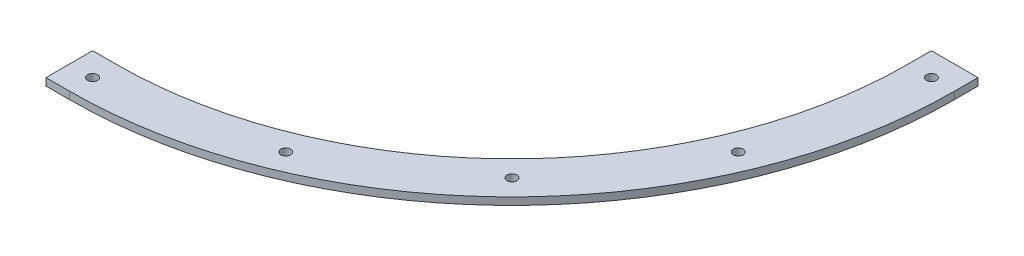
ISO-10303-21;
HEADER;
FILE_DESCRIPTION(('STEP AP214'),'2;1');
FILE_NAME('part.step','',(''),(''),'','','');
FILE_SCHEMA(('AUTOMOTIVE_DESIGN { 1 0 10303 214 1 1 1 1 }'));
ENDSEC;
DATA;
#1=APPLICATION_CONTEXT('core data for automotive mechanical design processes');
#2=APPLICATION_PROTOCOL_DEFINITION('international standard','automotive_design',2000,#1);
#3=PRODUCT_CONTEXT('',#1,'mechanical');
#4=PRODUCT('Part','Part','',(#3));
#5=PRODUCT_RELATED_PRODUCT_CATEGORY('part','',(#4));
#6=PRODUCT_DEFINITION_FORMATION('','',#4);
#7=PRODUCT_DEFINITION_CONTEXT('part definition',#1,'design');
#8=PRODUCT_DEFINITION('design','',#6,#7);
#9=PRODUCT_DEFINITION_SHAPE('','',#8);
#10=(LENGTH_UNIT() NAMED_UNIT(*) SI_UNIT(.MILLI.,.METRE.));
#11=(NAMED_UNIT(*) PLANE_ANGLE_UNIT() SI_UNIT($,.RADIAN.));
#12=(NAMED_UNIT(*) SI_UNIT($,.STERADIAN.) SOLID_ANGLE_UNIT());
#13=UNCERTAINTY_MEASURE_WITH_UNIT(LENGTH_MEASURE(1.E-05),#10,'distance_accuracy_value','');
#14=(GEOMETRIC_REPRESENTATION_CONTEXT(3) GLOBAL_UNCERTAINTY_ASSIGNED_CONTEXT((#13)) GLOBAL_UNIT_ASSIGNED_CONTEXT((#10,
#11,#12)) REPRESENTATION_CONTEXT('',''));
#15=CARTESIAN_POINT('',(0.,0.,0.));
#16=DIRECTION('',(0.,0.,1.));
#17=DIRECTION('',(1.,0.,0.));
#18=AXIS2_PLACEMENT_3D('',#15,#16,#17);
#19=CARTESIAN_POINT('',(280.,3.175,-3.10862446895044E-13));
#20=DIRECTION('',(1.,0.,0.));
#21=DIRECTION('',(0.,0.,-1.));
#22=AXIS2_PLACEMENT_3D('',#19,#20,#21);
#23=PLANE('',#22);
#24=DIRECTION('',(0.,0.,1.));
#25=VECTOR('',#24,1.);
#26=CARTESIAN_POINT('',(280.,3.175,-3.10862446895044E-13));
#27=LINE('',#26,#25);
#28=CARTESIAN_POINT('',(279.999999999996,3.175,80.0000000000061));
#29=VERTEX_POINT('',#28);
#30=CARTESIAN_POINT('',(279.999999999999,3.175,90.000000000002));
#31=VERTEX_POINT('',#30);
#32=EDGE_CURVE('E120',#29,#31,#27,.T.);
#33=ORIENTED_EDGE('',*,*,#32,.T.);
#34=DIRECTION('',(0.,1.,0.));
#35=VECTOR('',#34,1.);
#36=CARTESIAN_POINT('',(279.999999999999,0.,90.000000000002));
#37=LINE('',#36,#35);
#38=CARTESIAN_POINT('',(279.999999999999,0.,90.000000000002));
#39=VERTEX_POINT('',#38);
#40=EDGE_CURVE('E130',#39,#31,#37,.T.);
#41=ORIENTED_EDGE('',*,*,#40,.F.);
#42=DIRECTION('',(0.,0.,1.));
#43=VECTOR('',#42,1.);
#44=CARTESIAN_POINT('',(280.,0.,-3.10862446895044E-13));
#45=LINE('',#44,#43);
#46=CARTESIAN_POINT('',(279.999999999996,0.,80.0000000000061));
#47=VERTEX_POINT('',#46);
#48=EDGE_CURVE('E145',#47,#39,#45,.T.);
#49=ORIENTED_EDGE('',*,*,#48,.F.);
#50=DIRECTION('',(0.,1.,0.));
#51=VECTOR('',#50,1.);
#52=CARTESIAN_POINT('',(279.999999999996,0.,80.0000000000061));
#53=LINE('',#52,#51);
#54=EDGE_CURVE('E140',#47,#29,#53,.T.);
#55=ORIENTED_EDGE('',*,*,#54,.T.);
#56=EDGE_LOOP('',(#33,#41,#49,#55));
#57=FACE_BOUND('',#56,.T.);
#58=ADVANCED_FACE('F45',(#57),#23,.T.);
#59=CARTESIAN_POINT('',(89.9999999999998,3.175,270.));
#60=DIRECTION('',(0.,-1.,0.));
#61=DIRECTION('',(0.,0.,-1.));
#62=AXIS2_PLACEMENT_3D('',#59,#60,#61);
#63=CYLINDRICAL_SURFACE('',#62,2.12499999999998);
#64=CARTESIAN_POINT('',(89.9999999999998,3.175,270.));
#65=DIRECTION('',(0.,1.,0.));
#66=DIRECTION('',(0.,0.,1.));
#67=AXIS2_PLACEMENT_3D('',#64,#65,#66);
#68=CIRCLE('',#67,2.12499999999998);
#69=CARTESIAN_POINT('',(89.9999999999998,3.175,272.125));
#70=VERTEX_POINT('',#69);
#71=EDGE_CURVE('E55',#70,#70,#68,.T.);
#72=ORIENTED_EDGE('',*,*,#71,.T.);
#73=EDGE_LOOP('',(#72));
#74=FACE_BOUND('',#73,.T.);
#75=CARTESIAN_POINT('',(89.9999999999998,0.,270.));
#76=DIRECTION('',(0.,1.,0.));
#77=DIRECTION('',(0.,0.,1.));
#78=AXIS2_PLACEMENT_3D('',#75,#76,#77);
#79=CIRCLE('',#78,2.12499999999998);
#80=CARTESIAN_POINT('',(89.9999999999998,0.,272.125));
#81=VERTEX_POINT('',#80);
#82=EDGE_CURVE('E185',#81,#81,#79,.T.);
#83=ORIENTED_EDGE('',*,*,#82,.F.);
#84=EDGE_LOOP('',(#83));
#85=FACE_BOUND('',#84,.T.);
#86=ADVANCED_FACE('F47',(#74,#85),#63,.F.);
#87=CARTESIAN_POINT('',(0.,3.175,0.));
#88=DIRECTION('',(0.,1.,0.));
#89=DIRECTION('',(0.,0.,1.));
#90=AXIS2_PLACEMENT_3D('',#87,#88,#89);
#91=PLANE('',#90);
#92=CARTESIAN_POINT('',(256.207454383142,3.175,159.101968911715));
#93=DIRECTION('',(0.,1.,0.));
#94=DIRECTION('',(0.,0.,1.));
#95=AXIS2_PLACEMENT_3D('',#92,#93,#94);
#96=CIRCLE('',#95,2.12499999999993);
#97=CARTESIAN_POINT('',(256.207454383142,3.175,161.226968911715));
#98=VERTEX_POINT('',#97);
#99=EDGE_CURVE('E263',#98,#98,#96,.T.);
#100=ORIENTED_EDGE('',*,*,#99,.F.);
#101=EDGE_LOOP('',(#100));
#102=FACE_BOUND('',#101,.T.);
#103=CARTESIAN_POINT('',(159.101968911713,3.175,256.207454383144));
#104=DIRECTION('',(0.,1.,0.));
#105=DIRECTION('',(0.,0.,-1.));
#106=AXIS2_PLACEMENT_3D('',#103,#104,#105);
#107=CIRCLE('',#106,2.125);
#108=CARTESIAN_POINT('',(159.101968911713,3.175,254.082454383144));
#109=VERTEX_POINT('',#108);
#110=EDGE_CURVE('E267',#109,#109,#107,.T.);
#111=ORIENTED_EDGE('',*,*,#110,.F.);
#112=EDGE_LOOP('',(#111));
#113=FACE_BOUND('',#112,.T.);
#114=CARTESIAN_POINT('',(90.0000000000011,3.175,90.000000000002));
#115=DIRECTION('',(0.,1.,0.));
#116=DIRECTION('',(0.,0.,1.));
#117=AXIS2_PLACEMENT_3D('',#114,#115,#116);
#118=CIRCLE('',#117,189.999999999998);
#119=CARTESIAN_POINT('',(89.9999999999997,3.175,280.));
#120=VERTEX_POINT('',#119);
#121=EDGE_CURVE('E114',#120,#31,#118,.T.);
#122=ORIENTED_EDGE('',*,*,#121,.T.);
#123=ORIENTED_EDGE('',*,*,#32,.F.);
#124=DIRECTION('',(1.,0.,0.));
#125=VECTOR('',#124,1.);
#126=CARTESIAN_POINT('',(260.000000000002,3.175,80.0000000000061));
#127=LINE('',#126,#125);
#128=CARTESIAN_POINT('',(260.000000000002,3.175,80.0000000000061));
#129=VERTEX_POINT('',#128);
#130=EDGE_CURVE('E141',#129,#29,#127,.T.);
#131=ORIENTED_EDGE('',*,*,#130,.F.);
#132=DIRECTION('',(0.,0.,-1.));
#133=VECTOR('',#132,1.);
#134=CARTESIAN_POINT('',(260.000000000002,3.175,80.0000000000061));
#135=LINE('',#134,#133);
#136=CARTESIAN_POINT('',(260.000000000002,3.175,90.000000000003));
#137=VERTEX_POINT('',#136);
#138=EDGE_CURVE('E127',#137,#129,#135,.T.);
#139=ORIENTED_EDGE('',*,*,#138,.F.);
#140=CARTESIAN_POINT('',(90.0000000000011,3.175,90.000000000002));
#141=DIRECTION('',(0.,-1.,0.));
#142=DIRECTION('',(0.,0.,1.));
#143=AXIS2_PLACEMENT_3D('',#140,#141,#142);
#144=CIRCLE('',#143,169.999999999998);
#145=CARTESIAN_POINT('',(89.9999999999998,3.175,260.));
#146=VERTEX_POINT('',#145);
#147=EDGE_CURVE('E168',#137,#146,#144,.T.);
#148=ORIENTED_EDGE('',*,*,#147,.T.);
#149=DIRECTION('',(1.,0.,0.));
#150=VECTOR('',#149,1.);
#151=CARTESIAN_POINT('',(79.9999999999997,3.175,260.));
#152=LINE('',#151,#150);
#153=CARTESIAN_POINT('',(79.9999999999997,3.175,260.));
#154=VERTEX_POINT('',#153);
#155=EDGE_CURVE('E178',#154,#146,#152,.T.);
#156=ORIENTED_EDGE('',*,*,#155,.F.);
#157=DIRECTION('',(0.,0.,-1.));
#158=VECTOR('',#157,1.);
#159=CARTESIAN_POINT('',(79.9999999999997,3.175,260.));
#160=LINE('',#159,#158);
#161=CARTESIAN_POINT('',(79.9999999999997,3.175,280.));
#162=VERTEX_POINT('',#161);
#163=EDGE_CURVE('E164',#162,#154,#160,.T.);
#164=ORIENTED_EDGE('',*,*,#163,.F.);
#165=DIRECTION('',(-1.,0.,0.));
#166=VECTOR('',#165,1.);
#167=CARTESIAN_POINT('',(-4.6629367034257E-13,3.175,280.));
#168=LINE('',#167,#166);
#169=EDGE_CURVE('E11',#120,#162,#168,.T.);
#170=ORIENTED_EDGE('',*,*,#169,.F.);
#171=EDGE_LOOP('',(#122,#123,#131,#139,#148,#156,#164,#170));
#172=FACE_BOUND('',#171,.T.);
#173=CARTESIAN_POINT('',(217.279220613578,3.175,217.27922061358));
#174=DIRECTION('',(0.,1.,0.));
#175=DIRECTION('',(0.,0.,1.));
#176=AXIS2_PLACEMENT_3D('',#173,#174,#175);
#177=CIRCLE('',#176,2.12499999999994);
#178=CARTESIAN_POINT('',(217.279220613578,3.175,219.40422061358));
#179=VERTEX_POINT('',#178);
#180=EDGE_CURVE('E264',#179,#179,#177,.T.);
#181=ORIENTED_EDGE('',*,*,#180,.F.);
#182=EDGE_LOOP('',(#181));
#183=FACE_BOUND('',#182,.T.);
#184=ORIENTED_EDGE('',*,*,#71,.F.);
#185=EDGE_LOOP('',(#184));
#186=FACE_BOUND('',#185,.T.);
#187=CARTESIAN_POINT('',(269.999999999999,3.175,90.000000000003));
#188=DIRECTION('',(0.,-1.,0.));
#189=DIRECTION('',(0.,0.,1.));
#190=AXIS2_PLACEMENT_3D('',#187,#188,#189);
#191=CIRCLE('',#190,2.12499999999999);
#192=CARTESIAN_POINT('',(269.999999999999,3.175,92.125000000003));
#193=VERTEX_POINT('',#192);
#194=EDGE_CURVE('E126',#193,#193,#191,.T.);
#195=ORIENTED_EDGE('',*,*,#194,.T.);
#196=EDGE_LOOP('',(#195));
#197=FACE_BOUND('',#196,.T.);
#198=ADVANCED_FACE('F116',(#102,#113,#172,#183,#186,#197),#91,.T.);
#199=CARTESIAN_POINT('',(0.,0.,0.));
#200=DIRECTION('',(0.,1.,0.));
#201=DIRECTION('',(0.,0.,1.));
#202=AXIS2_PLACEMENT_3D('',#199,#200,#201);
#203=PLANE('',#202);
#204=CARTESIAN_POINT('',(256.207454383142,0.,159.101968911715));
#205=DIRECTION('',(0.,1.,0.));
#206=DIRECTION('',(0.,0.,1.));
#207=AXIS2_PLACEMENT_3D('',#204,#205,#206);
#208=CIRCLE('',#207,2.12499999999993);
#209=CARTESIAN_POINT('',(256.207454383142,0.,161.226968911715));
#210=VERTEX_POINT('',#209);
#211=EDGE_CURVE('E260',#210,#210,#208,.T.);
#212=ORIENTED_EDGE('',*,*,#211,.T.);
#213=EDGE_LOOP('',(#212));
#214=FACE_BOUND('',#213,.T.);
#215=CARTESIAN_POINT('',(159.101968911713,0.,256.207454383144));
#216=DIRECTION('',(0.,1.,0.));
#217=DIRECTION('',(0.,0.,-1.));
#218=AXIS2_PLACEMENT_3D('',#215,#216,#217);
#219=CIRCLE('',#218,2.125);
#220=CARTESIAN_POINT('',(159.101968911713,0.,254.082454383144));
#221=VERTEX_POINT('',#220);
#222=EDGE_CURVE('E136',#221,#221,#219,.T.);
#223=ORIENTED_EDGE('',*,*,#222,.T.);
#224=EDGE_LOOP('',(#223));
#225=FACE_BOUND('',#224,.T.);
#226=CARTESIAN_POINT('',(217.279220613578,0.,217.27922061358));
#227=DIRECTION('',(0.,1.,0.));
#228=DIRECTION('',(0.,0.,1.));
#229=AXIS2_PLACEMENT_3D('',#226,#227,#228);
#230=CIRCLE('',#229,2.12499999999994);
#231=CARTESIAN_POINT('',(217.279220613578,0.,219.40422061358));
#232=VERTEX_POINT('',#231);
#233=EDGE_CURVE('E158',#232,#232,#230,.T.);
#234=ORIENTED_EDGE('',*,*,#233,.T.);
#235=EDGE_LOOP('',(#234));
#236=FACE_BOUND('',#235,.T.);
#237=ORIENTED_EDGE('',*,*,#48,.T.);
#238=CARTESIAN_POINT('',(90.0000000000011,0.,90.000000000002));
#239=DIRECTION('',(0.,1.,0.));
#240=DIRECTION('',(0.,0.,1.));
#241=AXIS2_PLACEMENT_3D('',#238,#239,#240);
#242=CIRCLE('',#241,189.999999999998);
#243=CARTESIAN_POINT('',(89.9999999999997,0.,280.));
#244=VERTEX_POINT('',#243);
#245=EDGE_CURVE('E132',#39,#244,#242,.F.);
#246=ORIENTED_EDGE('',*,*,#245,.T.);
#247=DIRECTION('',(-1.,0.,0.));
#248=VECTOR('',#247,1.);
#249=CARTESIAN_POINT('',(-4.6629367034257E-13,0.,280.));
#250=LINE('',#249,#248);
#251=CARTESIAN_POINT('',(79.9999999999997,0.,280.));
#252=VERTEX_POINT('',#251);
#253=EDGE_CURVE('E49',#244,#252,#250,.T.);
#254=ORIENTED_EDGE('',*,*,#253,.T.);
#255=DIRECTION('',(0.,0.,-1.));
#256=VECTOR('',#255,1.);
#257=CARTESIAN_POINT('',(79.9999999999997,0.,260.));
#258=LINE('',#257,#256);
#259=CARTESIAN_POINT('',(79.9999999999997,0.,260.));
#260=VERTEX_POINT('',#259);
#261=EDGE_CURVE('E175',#252,#260,#258,.T.);
#262=ORIENTED_EDGE('',*,*,#261,.T.);
#263=DIRECTION('',(1.,0.,0.));
#264=VECTOR('',#263,1.);
#265=CARTESIAN_POINT('',(79.9999999999997,0.,260.));
#266=LINE('',#265,#264);
#267=CARTESIAN_POINT('',(90.0000000000011,0.,260.));
#268=VERTEX_POINT('',#267);
#269=EDGE_CURVE('E177',#260,#268,#266,.T.);
#270=ORIENTED_EDGE('',*,*,#269,.T.);
#271=CARTESIAN_POINT('',(90.0000000000011,0.,90.000000000002));
#272=DIRECTION('',(0.,1.,0.));
#273=DIRECTION('',(0.,0.,1.));
#274=AXIS2_PLACEMENT_3D('',#271,#272,#273);
#275=CIRCLE('',#274,169.999999999998);
#276=CARTESIAN_POINT('',(259.999999999999,0.,90.000000000003));
#277=VERTEX_POINT('',#276);
#278=EDGE_CURVE('E81',#268,#277,#275,.T.);
#279=ORIENTED_EDGE('',*,*,#278,.T.);
#280=DIRECTION('',(0.,0.,-1.));
#281=VECTOR('',#280,1.);
#282=CARTESIAN_POINT('',(260.000000000002,0.,80.0000000000061));
#283=LINE('',#282,#281);
#284=CARTESIAN_POINT('',(260.000000000002,0.,80.0000000000061));
#285=VERTEX_POINT('',#284);
#286=EDGE_CURVE('E156',#277,#285,#283,.T.);
#287=ORIENTED_EDGE('',*,*,#286,.T.);
#288=DIRECTION('',(1.,0.,0.));
#289=VECTOR('',#288,1.);
#290=CARTESIAN_POINT('',(260.000000000002,0.,80.0000000000061));
#291=LINE('',#290,#289);
#292=EDGE_CURVE('E153',#285,#47,#291,.T.);
#293=ORIENTED_EDGE('',*,*,#292,.T.);
#294=EDGE_LOOP('',(#237,#246,#254,#262,#270,#279,#287,#293));
#295=FACE_BOUND('',#294,.T.);
#296=ORIENTED_EDGE('',*,*,#82,.T.);
#297=EDGE_LOOP('',(#296));
#298=FACE_BOUND('',#297,.T.);
#299=CARTESIAN_POINT('',(269.999999999999,0.,90.000000000003));
#300=DIRECTION('',(0.,1.,0.));
#301=DIRECTION('',(0.,0.,1.));
#302=AXIS2_PLACEMENT_3D('',#299,#300,#301);
#303=CIRCLE('',#302,2.12499999999999);
#304=CARTESIAN_POINT('',(269.999999999999,0.,92.125000000003));
#305=VERTEX_POINT('',#304);
#306=EDGE_CURVE('E159',#305,#305,#303,.T.);
#307=ORIENTED_EDGE('',*,*,#306,.T.);
#308=EDGE_LOOP('',(#307));
#309=FACE_BOUND('',#308,.T.);
#310=ADVANCED_FACE('F191',(#214,#225,#236,#295,#298,#309),#203,.F.);
#311=CARTESIAN_POINT('',(-4.6629367034257E-13,3.175,280.));
#312=DIRECTION('',(0.,0.,1.));
#313=DIRECTION('',(1.,0.,0.));
#314=AXIS2_PLACEMENT_3D('',#311,#312,#313);
#315=PLANE('',#314);
#316=DIRECTION('',(0.,1.,0.));
#317=VECTOR('',#316,1.);
#318=CARTESIAN_POINT('',(89.9999999999997,0.,280.));
#319=LINE('',#318,#317);
#320=EDGE_CURVE('E137',#244,#120,#319,.T.);
#321=ORIENTED_EDGE('',*,*,#320,.T.);
#322=ORIENTED_EDGE('',*,*,#169,.T.);
#323=DIRECTION('',(0.,1.,0.));
#324=VECTOR('',#323,1.);
#325=CARTESIAN_POINT('',(79.9999999999997,0.,280.));
#326=LINE('',#325,#324);
#327=EDGE_CURVE('E182',#252,#162,#326,.T.);
#328=ORIENTED_EDGE('',*,*,#327,.F.);
#329=ORIENTED_EDGE('',*,*,#253,.F.);
#330=EDGE_LOOP('',(#321,#322,#328,#329));
#331=FACE_BOUND('',#330,.T.);
#332=ADVANCED_FACE('F218',(#331),#315,.T.);
#333=CARTESIAN_POINT('',(79.9999999999997,0.,260.));
#334=DIRECTION('',(0.,0.,1.));
#335=DIRECTION('',(1.,0.,0.));
#336=AXIS2_PLACEMENT_3D('',#333,#334,#335);
#337=PLANE('',#336);
#338=ORIENTED_EDGE('',*,*,#155,.T.);
#339=DIRECTION('',(0.,1.,0.));
#340=VECTOR('',#339,1.);
#341=CARTESIAN_POINT('',(89.9999999999998,-268.700576850886,260.));
#342=LINE('',#341,#340);
#343=EDGE_CURVE('E162',#268,#146,#342,.T.);
#344=ORIENTED_EDGE('',*,*,#343,.F.);
#345=ORIENTED_EDGE('',*,*,#269,.F.);
#346=DIRECTION('',(0.,1.,0.));
#347=VECTOR('',#346,1.);
#348=CARTESIAN_POINT('',(79.9999999999997,0.,260.));
#349=LINE('',#348,#347);
#350=EDGE_CURVE('E74',#260,#154,#349,.T.);
#351=ORIENTED_EDGE('',*,*,#350,.T.);
#352=EDGE_LOOP('',(#338,#344,#345,#351));
#353=FACE_BOUND('',#352,.T.);
#354=ADVANCED_FACE('F224',(#353),#337,.F.);
#355=CARTESIAN_POINT('',(79.9999999999997,0.,260.));
#356=DIRECTION('',(1.,0.,0.));
#357=DIRECTION('',(0.,0.,-1.));
#358=AXIS2_PLACEMENT_3D('',#355,#356,#357);
#359=PLANE('',#358);
#360=ORIENTED_EDGE('',*,*,#163,.T.);
#361=ORIENTED_EDGE('',*,*,#350,.F.);
#362=ORIENTED_EDGE('',*,*,#261,.F.);
#363=ORIENTED_EDGE('',*,*,#327,.T.);
#364=EDGE_LOOP('',(#360,#361,#362,#363));
#365=FACE_BOUND('',#364,.T.);
#366=ADVANCED_FACE('F229',(#365),#359,.F.);
#367=CARTESIAN_POINT('',(90.0000000000011,-268.700576850886,90.000000000002));
#368=DIRECTION('',(0.,1.,0.));
#369=DIRECTION('',(0.,0.,1.));
#370=AXIS2_PLACEMENT_3D('',#367,#368,#369);
#371=CYLINDRICAL_SURFACE('',#370,189.999999999998);
#372=ORIENTED_EDGE('',*,*,#245,.F.);
#373=ORIENTED_EDGE('',*,*,#40,.T.);
#374=ORIENTED_EDGE('',*,*,#121,.F.);
#375=ORIENTED_EDGE('',*,*,#320,.F.);
#376=EDGE_LOOP('',(#372,#373,#374,#375));
#377=FACE_BOUND('',#376,.T.);
#378=ADVANCED_FACE('F131',(#377),#371,.T.);
#379=CARTESIAN_POINT('',(90.0000000000011,-268.700576850886,90.000000000002));
#380=DIRECTION('',(0.,1.,0.));
#381=DIRECTION('',(0.,0.,1.));
#382=AXIS2_PLACEMENT_3D('',#379,#380,#381);
#383=CYLINDRICAL_SURFACE('',#382,169.999999999998);
#384=ORIENTED_EDGE('',*,*,#278,.F.);
#385=ORIENTED_EDGE('',*,*,#343,.T.);
#386=ORIENTED_EDGE('',*,*,#147,.F.);
#387=DIRECTION('',(0.,1.,0.));
#388=VECTOR('',#387,1.);
#389=CARTESIAN_POINT('',(259.999999999999,-268.700576850886,90.0000000000029));
#390=LINE('',#389,#388);
#391=EDGE_CURVE('E171',#277,#137,#390,.T.);
#392=ORIENTED_EDGE('',*,*,#391,.F.);
#393=EDGE_LOOP('',(#384,#385,#386,#392));
#394=FACE_BOUND('',#393,.T.);
#395=ADVANCED_FACE('F214',(#394),#383,.F.);
#396=CARTESIAN_POINT('',(269.999999999999,-268.700576850886,90.000000000003));
#397=DIRECTION('',(0.,1.,0.));
#398=DIRECTION('',(0.,0.,1.));
#399=AXIS2_PLACEMENT_3D('',#396,#397,#398);
#400=CYLINDRICAL_SURFACE('',#399,2.12499999999999);
#401=ORIENTED_EDGE('',*,*,#194,.F.);
#402=EDGE_LOOP('',(#401));
#403=FACE_BOUND('',#402,.T.);
#404=ORIENTED_EDGE('',*,*,#306,.F.);
#405=EDGE_LOOP('',(#404));
#406=FACE_BOUND('',#405,.T.);
#407=ADVANCED_FACE('F210',(#403,#406),#400,.F.);
#408=CARTESIAN_POINT('',(260.000000000002,0.,80.0000000000061));
#409=DIRECTION('',(0.,0.,1.));
#410=DIRECTION('',(1.,0.,0.));
#411=AXIS2_PLACEMENT_3D('',#408,#409,#410);
#412=PLANE('',#411);
#413=ORIENTED_EDGE('',*,*,#130,.T.);
#414=ORIENTED_EDGE('',*,*,#54,.F.);
#415=ORIENTED_EDGE('',*,*,#292,.F.);
#416=DIRECTION('',(0.,1.,0.));
#417=VECTOR('',#416,1.);
#418=CARTESIAN_POINT('',(260.000000000002,0.,80.0000000000061));
#419=LINE('',#418,#417);
#420=EDGE_CURVE('E143',#285,#129,#419,.T.);
#421=ORIENTED_EDGE('',*,*,#420,.T.);
#422=EDGE_LOOP('',(#413,#414,#415,#421));
#423=FACE_BOUND('',#422,.T.);
#424=ADVANCED_FACE('F213',(#423),#412,.F.);
#425=CARTESIAN_POINT('',(260.000000000002,0.,80.0000000000061));
#426=DIRECTION('',(1.,0.,0.));
#427=DIRECTION('',(0.,0.,-1.));
#428=AXIS2_PLACEMENT_3D('',#425,#426,#427);
#429=PLANE('',#428);
#430=ORIENTED_EDGE('',*,*,#391,.T.);
#431=ORIENTED_EDGE('',*,*,#138,.T.);
#432=ORIENTED_EDGE('',*,*,#420,.F.);
#433=ORIENTED_EDGE('',*,*,#286,.F.);
#434=EDGE_LOOP('',(#430,#431,#432,#433));
#435=FACE_BOUND('',#434,.T.);
#436=ADVANCED_FACE('F240',(#435),#429,.F.);
#437=CARTESIAN_POINT('',(217.279220613578,0.,217.27922061358));
#438=DIRECTION('',(0.,1.,0.));
#439=DIRECTION('',(0.,0.,1.));
#440=AXIS2_PLACEMENT_3D('',#437,#438,#439);
#441=CYLINDRICAL_SURFACE('',#440,2.12499999999994);
#442=ORIENTED_EDGE('',*,*,#233,.F.);
#443=EDGE_LOOP('',(#442));
#444=FACE_BOUND('',#443,.T.);
#445=ORIENTED_EDGE('',*,*,#180,.T.);
#446=EDGE_LOOP('',(#445));
#447=FACE_BOUND('',#446,.T.);
#448=ADVANCED_FACE('F243',(#444,#447),#441,.F.);
#449=CARTESIAN_POINT('',(159.101968911713,0.,256.207454383144));
#450=DIRECTION('',(0.,1.,0.));
#451=DIRECTION('',(0.,0.,1.));
#452=AXIS2_PLACEMENT_3D('',#449,#450,#451);
#453=CYLINDRICAL_SURFACE('',#452,2.125);
#454=ORIENTED_EDGE('',*,*,#222,.F.);
#455=EDGE_LOOP('',(#454));
#456=FACE_BOUND('',#455,.T.);
#457=ORIENTED_EDGE('',*,*,#110,.T.);
#458=EDGE_LOOP('',(#457));
#459=FACE_BOUND('',#458,.T.);
#460=ADVANCED_FACE('F248',(#456,#459),#453,.F.);
#461=CARTESIAN_POINT('',(256.207454383142,0.,159.101968911715));
#462=DIRECTION('',(0.,1.,0.));
#463=DIRECTION('',(0.,0.,1.));
#464=AXIS2_PLACEMENT_3D('',#461,#462,#463);
#465=CYLINDRICAL_SURFACE('',#464,2.12499999999993);
#466=ORIENTED_EDGE('',*,*,#211,.F.);
#467=EDGE_LOOP('',(#466));
#468=FACE_BOUND('',#467,.T.);
#469=ORIENTED_EDGE('',*,*,#99,.T.);
#470=EDGE_LOOP('',(#469));
#471=FACE_BOUND('',#470,.T.);
#472=ADVANCED_FACE('F252',(#468,#471),#465,.F.);
#473=CLOSED_SHELL('',(#58,#86,#198,#310,#332,#354,#366,#378,#395,#407,#424,#436,#448,#460,#472));
#474=MANIFOLD_SOLID_BREP('B2',#473);
#475=ADVANCED_BREP_SHAPE_REPRESENTATION('',(#18,#474),#14);
#476=SHAPE_DEFINITION_REPRESENTATION(#9,#475);
ENDSEC;
END-ISO-10303-21;
